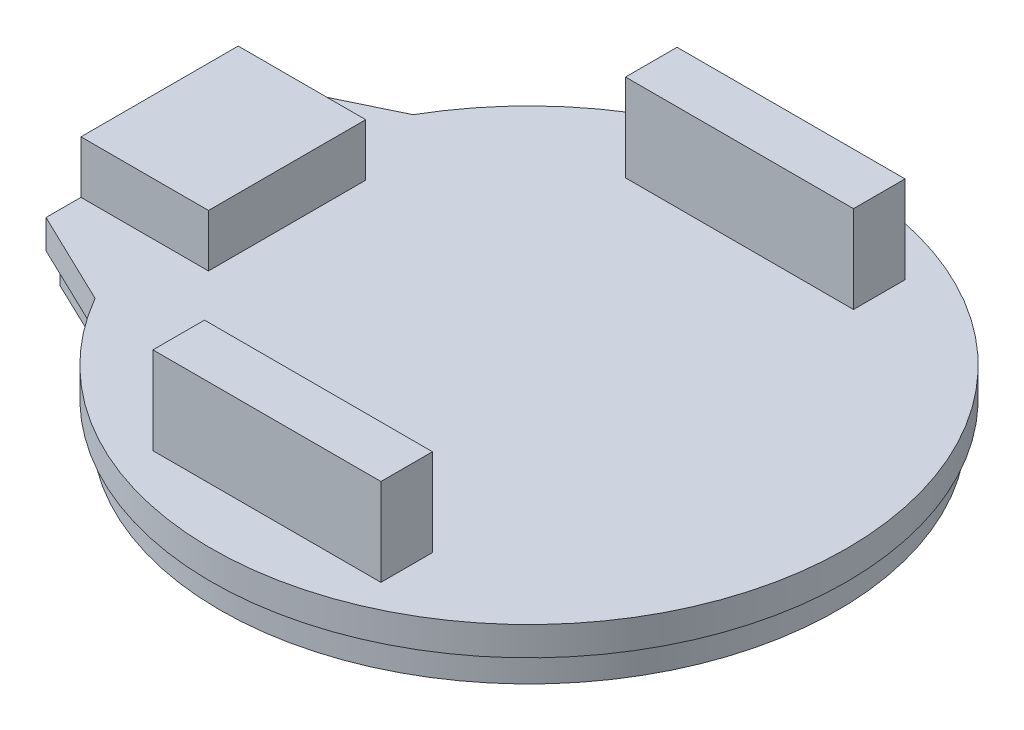
ISO-10303-21;
HEADER;
FILE_DESCRIPTION(('STEP AP214'),'2;1');
FILE_NAME('part.step','',(''),(''),'','','');
FILE_SCHEMA(('AUTOMOTIVE_DESIGN { 1 0 10303 214 1 1 1 1 }'));
ENDSEC;
DATA;
#1=APPLICATION_CONTEXT('core data for automotive mechanical design processes');
#2=APPLICATION_PROTOCOL_DEFINITION('international standard','automotive_design',2000,#1);
#3=PRODUCT_CONTEXT('',#1,'mechanical');
#4=PRODUCT('Part','Part','',(#3));
#5=PRODUCT_RELATED_PRODUCT_CATEGORY('part','',(#4));
#6=PRODUCT_DEFINITION_FORMATION('','',#4);
#7=PRODUCT_DEFINITION_CONTEXT('part definition',#1,'design');
#8=PRODUCT_DEFINITION('design','',#6,#7);
#9=PRODUCT_DEFINITION_SHAPE('','',#8);
#10=(LENGTH_UNIT() NAMED_UNIT(*) SI_UNIT(.MILLI.,.METRE.));
#11=(NAMED_UNIT(*) PLANE_ANGLE_UNIT() SI_UNIT($,.RADIAN.));
#12=(NAMED_UNIT(*) SI_UNIT($,.STERADIAN.) SOLID_ANGLE_UNIT());
#13=UNCERTAINTY_MEASURE_WITH_UNIT(LENGTH_MEASURE(1.E-05),#10,'distance_accuracy_value','');
#14=(GEOMETRIC_REPRESENTATION_CONTEXT(3) GLOBAL_UNCERTAINTY_ASSIGNED_CONTEXT((#13)) GLOBAL_UNIT_ASSIGNED_CONTEXT((#10,
#11,#12)) REPRESENTATION_CONTEXT('',''));
#15=CARTESIAN_POINT('',(0.,0.,0.));
#16=DIRECTION('',(0.,0.,1.));
#17=DIRECTION('',(1.,0.,0.));
#18=AXIS2_PLACEMENT_3D('',#15,#16,#17);
#19=CARTESIAN_POINT('',(10.0040335639318,10.8,419.56));
#20=DIRECTION('',(0.,0.,-1.));
#21=DIRECTION('',(1.,0.,0.));
#22=AXIS2_PLACEMENT_3D('',#19,#20,#21);
#23=PLANE('',#22);
#24=DIRECTION('',(0.,-1.,0.));
#25=VECTOR('',#24,1.);
#26=CARTESIAN_POINT('',(6.35403356393178,10.8,419.56));
#27=LINE('',#26,#25);
#28=CARTESIAN_POINT('',(6.35403356393178,8.8,419.56));
#29=VERTEX_POINT('',#28);
#30=CARTESIAN_POINT('',(6.35403356393178,5.8,419.56));
#31=VERTEX_POINT('',#30);
#32=EDGE_CURVE('E163',#29,#31,#27,.T.);
#33=ORIENTED_EDGE('',*,*,#32,.F.);
#34=DIRECTION('',(1.,0.,0.));
#35=VECTOR('',#34,1.);
#36=CARTESIAN_POINT('',(10.0040335639318,8.8,419.56));
#37=LINE('',#36,#35);
#38=CARTESIAN_POINT('',(13.6540335639318,8.8,419.56));
#39=VERTEX_POINT('',#38);
#40=EDGE_CURVE('E151',#29,#39,#37,.T.);
#41=ORIENTED_EDGE('',*,*,#40,.T.);
#42=DIRECTION('',(0.,-1.,0.));
#43=VECTOR('',#42,1.);
#44=CARTESIAN_POINT('',(13.6540335639318,10.8,419.56));
#45=LINE('',#44,#43);
#46=CARTESIAN_POINT('',(13.6540335639318,5.8,419.56));
#47=VERTEX_POINT('',#46);
#48=EDGE_CURVE('E182',#39,#47,#45,.T.);
#49=ORIENTED_EDGE('',*,*,#48,.T.);
#50=DIRECTION('',(1.,0.,0.));
#51=VECTOR('',#50,1.);
#52=CARTESIAN_POINT('',(10.0040335639318,5.8,419.56));
#53=LINE('',#52,#51);
#54=EDGE_CURVE('E170',#31,#47,#53,.T.);
#55=ORIENTED_EDGE('',*,*,#54,.F.);
#56=EDGE_LOOP('',(#33,#41,#49,#55));
#57=FACE_BOUND('',#56,.T.);
#58=ADVANCED_FACE('F16',(#57),#23,.T.);
#59=CARTESIAN_POINT('',(10.0040335639318,10.8,428.56));
#60=DIRECTION('',(0.,0.,-1.));
#61=DIRECTION('',(1.,0.,0.));
#62=AXIS2_PLACEMENT_3D('',#59,#60,#61);
#63=PLANE('',#62);
#64=DIRECTION('',(1.,0.,0.));
#65=VECTOR('',#64,1.);
#66=CARTESIAN_POINT('',(10.0040335639318,8.8,428.56));
#67=LINE('',#66,#65);
#68=CARTESIAN_POINT('',(6.35403356393178,8.8,428.56));
#69=VERTEX_POINT('',#68);
#70=CARTESIAN_POINT('',(13.6540335639318,8.8,428.56));
#71=VERTEX_POINT('',#70);
#72=EDGE_CURVE('E32',#69,#71,#67,.T.);
#73=ORIENTED_EDGE('',*,*,#72,.F.);
#74=DIRECTION('',(0.,-1.,0.));
#75=VECTOR('',#74,1.);
#76=CARTESIAN_POINT('',(6.35403356393178,10.8,428.56));
#77=LINE('',#76,#75);
#78=CARTESIAN_POINT('',(6.35403356393178,5.8,428.56));
#79=VERTEX_POINT('',#78);
#80=EDGE_CURVE('E166',#69,#79,#77,.T.);
#81=ORIENTED_EDGE('',*,*,#80,.T.);
#82=DIRECTION('',(1.,0.,0.));
#83=VECTOR('',#82,1.);
#84=CARTESIAN_POINT('',(10.0040335639318,5.8,428.56));
#85=LINE('',#84,#83);
#86=CARTESIAN_POINT('',(13.6540335639318,5.8,428.56));
#87=VERTEX_POINT('',#86);
#88=EDGE_CURVE('E251',#79,#87,#85,.T.);
#89=ORIENTED_EDGE('',*,*,#88,.T.);
#90=DIRECTION('',(0.,-1.,0.));
#91=VECTOR('',#90,1.);
#92=CARTESIAN_POINT('',(13.6540335639318,10.8,428.56));
#93=LINE('',#92,#91);
#94=EDGE_CURVE('E176',#71,#87,#93,.T.);
#95=ORIENTED_EDGE('',*,*,#94,.F.);
#96=EDGE_LOOP('',(#73,#81,#89,#95));
#97=FACE_BOUND('',#96,.T.);
#98=ADVANCED_FACE('F322',(#97),#63,.F.);
#99=CARTESIAN_POINT('',(13.6540335639318,10.8,424.06));
#100=DIRECTION('',(1.,0.,0.));
#101=DIRECTION('',(0.,0.,1.));
#102=AXIS2_PLACEMENT_3D('',#99,#100,#101);
#103=PLANE('',#102);
#104=ORIENTED_EDGE('',*,*,#48,.F.);
#105=DIRECTION('',(0.,0.,1.));
#106=VECTOR('',#105,1.);
#107=CARTESIAN_POINT('',(13.6540335639318,8.8,424.06));
#108=LINE('',#107,#106);
#109=EDGE_CURVE('E155',#39,#71,#108,.T.);
#110=ORIENTED_EDGE('',*,*,#109,.T.);
#111=ORIENTED_EDGE('',*,*,#94,.T.);
#112=DIRECTION('',(0.,0.,1.));
#113=VECTOR('',#112,1.);
#114=CARTESIAN_POINT('',(13.6540335639318,5.8,424.06));
#115=LINE('',#114,#113);
#116=EDGE_CURVE('E253',#47,#87,#115,.T.);
#117=ORIENTED_EDGE('',*,*,#116,.F.);
#118=EDGE_LOOP('',(#104,#110,#111,#117));
#119=FACE_BOUND('',#118,.T.);
#120=ADVANCED_FACE('F321',(#119),#103,.T.);
#121=CARTESIAN_POINT('',(26.0170167819659,5.8,424.06));
#122=DIRECTION('',(0.,1.,0.));
#123=DIRECTION('',(0.,0.,1.));
#124=AXIS2_PLACEMENT_3D('',#121,#122,#123);
#125=PLANE('',#124);
#126=DIRECTION('',(0.,0.,1.));
#127=VECTOR('',#126,1.);
#128=CARTESIAN_POINT('',(34.025,5.8,437.585));
#129=LINE('',#128,#127);
#130=CARTESIAN_POINT('',(34.025,5.8,436.11));
#131=VERTEX_POINT('',#130);
#132=CARTESIAN_POINT('',(34.025,5.8,439.06));
#133=VERTEX_POINT('',#132);
#134=EDGE_CURVE('E302',#131,#133,#129,.T.);
#135=ORIENTED_EDGE('',*,*,#134,.T.);
#136=DIRECTION('',(-1.,0.,0.));
#137=VECTOR('',#136,1.);
#138=CARTESIAN_POINT('',(27.5,5.8,439.06));
#139=LINE('',#138,#137);
#140=CARTESIAN_POINT('',(20.975,5.8,439.06));
#141=VERTEX_POINT('',#140);
#142=EDGE_CURVE('E309',#133,#141,#139,.T.);
#143=ORIENTED_EDGE('',*,*,#142,.T.);
#144=DIRECTION('',(0.,0.,1.));
#145=VECTOR('',#144,1.);
#146=CARTESIAN_POINT('',(20.975,5.8,437.585));
#147=LINE('',#146,#145);
#148=CARTESIAN_POINT('',(20.975,5.8,436.11));
#149=VERTEX_POINT('',#148);
#150=EDGE_CURVE('E306',#149,#141,#147,.T.);
#151=ORIENTED_EDGE('',*,*,#150,.F.);
#152=DIRECTION('',(-1.,0.,0.));
#153=VECTOR('',#152,1.);
#154=CARTESIAN_POINT('',(27.5,5.8,436.11));
#155=LINE('',#154,#153);
#156=EDGE_CURVE('E40',#131,#149,#155,.T.);
#157=ORIENTED_EDGE('',*,*,#156,.F.);
#158=EDGE_LOOP('',(#135,#143,#151,#157));
#159=FACE_BOUND('',#158,.T.);
#160=DIRECTION('',(0.,0.,1.));
#161=VECTOR('',#160,1.);
#162=CARTESIAN_POINT('',(34.025,5.8,410.535));
#163=LINE('',#162,#161);
#164=CARTESIAN_POINT('',(34.025,5.8,409.06));
#165=VERTEX_POINT('',#164);
#166=CARTESIAN_POINT('',(34.025,5.8,412.01));
#167=VERTEX_POINT('',#166);
#168=EDGE_CURVE('E280',#165,#167,#163,.T.);
#169=ORIENTED_EDGE('',*,*,#168,.T.);
#170=DIRECTION('',(-1.,0.,0.));
#171=VECTOR('',#170,1.);
#172=CARTESIAN_POINT('',(27.5,5.8,412.01));
#173=LINE('',#172,#171);
#174=CARTESIAN_POINT('',(20.975,5.8,412.01));
#175=VERTEX_POINT('',#174);
#176=EDGE_CURVE('E271',#167,#175,#173,.T.);
#177=ORIENTED_EDGE('',*,*,#176,.T.);
#178=DIRECTION('',(0.,0.,1.));
#179=VECTOR('',#178,1.);
#180=CARTESIAN_POINT('',(20.975,5.8,410.535));
#181=LINE('',#180,#179);
#182=CARTESIAN_POINT('',(20.975,5.8,409.06));
#183=VERTEX_POINT('',#182);
#184=EDGE_CURVE('E274',#183,#175,#181,.T.);
#185=ORIENTED_EDGE('',*,*,#184,.F.);
#186=DIRECTION('',(-1.,0.,0.));
#187=VECTOR('',#186,1.);
#188=CARTESIAN_POINT('',(27.5,5.8,409.06));
#189=LINE('',#188,#187);
#190=EDGE_CURVE('E277',#165,#183,#189,.T.);
#191=ORIENTED_EDGE('',*,*,#190,.F.);
#192=EDGE_LOOP('',(#169,#177,#185,#191));
#193=FACE_BOUND('',#192,.T.);
#194=DIRECTION('',(0.,0.,1.));
#195=VECTOR('',#194,1.);
#196=CARTESIAN_POINT('',(6.35403356393178,5.8,429.56));
#197=LINE('',#196,#195);
#198=CARTESIAN_POINT('',(6.35403356393178,5.8,417.56));
#199=VERTEX_POINT('',#198);
#200=EDGE_CURVE('E227',#199,#31,#197,.T.);
#201=ORIENTED_EDGE('',*,*,#200,.T.);
#202=ORIENTED_EDGE('',*,*,#54,.T.);
#203=ORIENTED_EDGE('',*,*,#116,.T.);
#204=ORIENTED_EDGE('',*,*,#88,.F.);
#205=CARTESIAN_POINT('',(6.35403356393178,5.8,430.56));
#206=VERTEX_POINT('',#205);
#207=EDGE_CURVE('E207',#79,#206,#197,.T.);
#208=ORIENTED_EDGE('',*,*,#207,.T.);
#209=DIRECTION('',(0.901233722306386,0.,0.433333333333332));
#210=VECTOR('',#209,1.);
#211=CARTESIAN_POINT('',(9.05773473085094,5.8,431.86));
#212=LINE('',#211,#210);
#213=CARTESIAN_POINT('',(11.7614358977701,5.8,433.16));
#214=VERTEX_POINT('',#213);
#215=EDGE_CURVE('E229',#206,#214,#212,.T.);
#216=ORIENTED_EDGE('',*,*,#215,.T.);
#217=CARTESIAN_POINT('',(27.5,5.8,424.06));
#218=DIRECTION('',(0.,-1.,0.));
#219=DIRECTION('',(-1.,0.,0.));
#220=AXIS2_PLACEMENT_3D('',#217,#218,#219);
#221=CIRCLE('',#220,18.18);
#222=CARTESIAN_POINT('',(11.7614358977701,5.8,414.96));
#223=VERTEX_POINT('',#222);
#224=EDGE_CURVE('E232',#223,#214,#221,.T.);
#225=ORIENTED_EDGE('',*,*,#224,.F.);
#226=DIRECTION('',(-0.901233722306386,0.,0.433333333333332));
#227=VECTOR('',#226,1.);
#228=CARTESIAN_POINT('',(9.05773473085094,5.8,416.26));
#229=LINE('',#228,#227);
#230=EDGE_CURVE('E217',#223,#199,#229,.T.);
#231=ORIENTED_EDGE('',*,*,#230,.T.);
#232=EDGE_LOOP('',(#201,#202,#203,#204,#208,#216,#225,#231));
#233=FACE_BOUND('',#232,.T.);
#234=ADVANCED_FACE('F246',(#159,#193,#233),#125,.T.);
#235=CARTESIAN_POINT('',(26.0170167819659,4.15,424.06));
#236=DIRECTION('',(0.,1.,0.));
#237=DIRECTION('',(0.,0.,1.));
#238=AXIS2_PLACEMENT_3D('',#235,#236,#237);
#239=PLANE('',#238);
#240=DIRECTION('',(-0.901233722306386,0.,0.433333333333332));
#241=VECTOR('',#240,1.);
#242=CARTESIAN_POINT('',(9.05773473085094,4.15,416.26));
#243=LINE('',#242,#241);
#244=CARTESIAN_POINT('',(11.7614358977701,4.15,414.96));
#245=VERTEX_POINT('',#244);
#246=CARTESIAN_POINT('',(6.35403356393178,4.15,417.56));
#247=VERTEX_POINT('',#246);
#248=EDGE_CURVE('E223',#245,#247,#243,.T.);
#249=ORIENTED_EDGE('',*,*,#248,.F.);
#250=CARTESIAN_POINT('',(27.5,4.15,424.06));
#251=DIRECTION('',(0.,-1.,0.));
#252=DIRECTION('',(-1.,0.,0.));
#253=AXIS2_PLACEMENT_3D('',#250,#251,#252);
#254=CIRCLE('',#253,18.18);
#255=CARTESIAN_POINT('',(11.7614358977701,4.15,433.16));
#256=VERTEX_POINT('',#255);
#257=EDGE_CURVE('E220',#245,#256,#254,.T.);
#258=ORIENTED_EDGE('',*,*,#257,.T.);
#259=DIRECTION('',(0.901233722306386,0.,0.433333333333332));
#260=VECTOR('',#259,1.);
#261=CARTESIAN_POINT('',(9.05773473085094,4.15,431.86));
#262=LINE('',#261,#260);
#263=CARTESIAN_POINT('',(6.35403356393178,4.15,430.56));
#264=VERTEX_POINT('',#263);
#265=EDGE_CURVE('E216',#264,#256,#262,.T.);
#266=ORIENTED_EDGE('',*,*,#265,.F.);
#267=DIRECTION('',(0.,0.,1.));
#268=VECTOR('',#267,1.);
#269=CARTESIAN_POINT('',(6.35403356393178,4.15,429.56));
#270=LINE('',#269,#268);
#271=EDGE_CURVE('E213',#247,#264,#270,.T.);
#272=ORIENTED_EDGE('',*,*,#271,.F.);
#273=EDGE_LOOP('',(#249,#258,#266,#272));
#274=FACE_BOUND('',#273,.T.);
#275=CARTESIAN_POINT('',(27.5,4.15,424.06));
#276=DIRECTION('',(0.,1.,0.));
#277=DIRECTION('',(-1.,0.,0.));
#278=AXIS2_PLACEMENT_3D('',#275,#276,#277);
#279=CIRCLE('',#278,17.68);
#280=CARTESIAN_POINT('',(12.1181560668604,4.15,415.343276004338));
#281=VERTEX_POINT('',#280);
#282=CARTESIAN_POINT('',(12.1181560668604,4.15,432.776723995661));
#283=VERTEX_POINT('',#282);
#284=EDGE_CURVE('E171',#281,#283,#279,.F.);
#285=ORIENTED_EDGE('',*,*,#284,.F.);
#286=DIRECTION('',(0.901233722306386,0.,-0.433333333333332));
#287=VECTOR('',#286,1.);
#288=CARTESIAN_POINT('',(9.27440139751761,4.15,416.710616861153));
#289=LINE('',#288,#287);
#290=CARTESIAN_POINT('',(6.85403356393178,4.15,417.874383856618));
#291=VERTEX_POINT('',#290);
#292=EDGE_CURVE('E203',#281,#291,#289,.F.);
#293=ORIENTED_EDGE('',*,*,#292,.T.);
#294=DIRECTION('',(0.,0.,-1.));
#295=VECTOR('',#294,1.);
#296=CARTESIAN_POINT('',(6.85403356393178,4.15,429.56));
#297=LINE('',#296,#295);
#298=CARTESIAN_POINT('',(6.85403356393178,4.15,430.245616143381));
#299=VERTEX_POINT('',#298);
#300=EDGE_CURVE('E187',#291,#299,#297,.F.);
#301=ORIENTED_EDGE('',*,*,#300,.T.);
#302=DIRECTION('',(-0.901233722306386,0.,-0.433333333333332));
#303=VECTOR('',#302,1.);
#304=CARTESIAN_POINT('',(9.2744013975176,4.15,431.409383138846));
#305=LINE('',#304,#303);
#306=EDGE_CURVE('E193',#299,#283,#305,.F.);
#307=ORIENTED_EDGE('',*,*,#306,.T.);
#308=EDGE_LOOP('',(#285,#293,#301,#307));
#309=FACE_BOUND('',#308,.T.);
#310=ADVANCED_FACE('F356',(#274,#309),#239,.F.);
#311=CARTESIAN_POINT('',(9.05773473085094,4.15,416.26));
#312=DIRECTION('',(-0.433333333333332,0.,-0.901233722306386));
#313=DIRECTION('',(0.901233722306386,0.,-0.433333333333332));
#314=AXIS2_PLACEMENT_3D('',#311,#312,#313);
#315=PLANE('',#314);
#316=ORIENTED_EDGE('',*,*,#230,.F.);
#317=DIRECTION('',(0.,1.,0.));
#318=VECTOR('',#317,1.);
#319=CARTESIAN_POINT('',(11.7614358977701,4.15,414.96));
#320=LINE('',#319,#318);
#321=EDGE_CURVE('E226',#245,#223,#320,.T.);
#322=ORIENTED_EDGE('',*,*,#321,.F.);
#323=ORIENTED_EDGE('',*,*,#248,.T.);
#324=DIRECTION('',(0.,1.,0.));
#325=VECTOR('',#324,1.);
#326=CARTESIAN_POINT('',(6.35403356393178,4.15,417.56));
#327=LINE('',#326,#325);
#328=EDGE_CURVE('E11',#247,#199,#327,.T.);
#329=ORIENTED_EDGE('',*,*,#328,.T.);
#330=EDGE_LOOP('',(#316,#322,#323,#329));
#331=FACE_BOUND('',#330,.T.);
#332=ADVANCED_FACE('F359',(#331),#315,.T.);
#333=CARTESIAN_POINT('',(6.35403356393178,4.15,429.56));
#334=DIRECTION('',(-1.,0.,0.));
#335=DIRECTION('',(0.,0.,-1.));
#336=AXIS2_PLACEMENT_3D('',#333,#334,#335);
#337=PLANE('',#336);
#338=DIRECTION('',(0.,0.,1.));
#339=VECTOR('',#338,1.);
#340=CARTESIAN_POINT('',(6.35403356393178,8.8,424.06));
#341=LINE('',#340,#339);
#342=EDGE_CURVE('E154',#29,#69,#341,.T.);
#343=ORIENTED_EDGE('',*,*,#342,.F.);
#344=ORIENTED_EDGE('',*,*,#32,.T.);
#345=ORIENTED_EDGE('',*,*,#200,.F.);
#346=ORIENTED_EDGE('',*,*,#328,.F.);
#347=ORIENTED_EDGE('',*,*,#271,.T.);
#348=DIRECTION('',(0.,1.,0.));
#349=VECTOR('',#348,1.);
#350=CARTESIAN_POINT('',(6.35403356393178,4.15,430.56));
#351=LINE('',#350,#349);
#352=EDGE_CURVE('E20',#264,#206,#351,.T.);
#353=ORIENTED_EDGE('',*,*,#352,.T.);
#354=ORIENTED_EDGE('',*,*,#207,.F.);
#355=ORIENTED_EDGE('',*,*,#80,.F.);
#356=EDGE_LOOP('',(#343,#344,#345,#346,#347,#353,#354,#355));
#357=FACE_BOUND('',#356,.T.);
#358=ADVANCED_FACE('F18',(#357),#337,.T.);
#359=CARTESIAN_POINT('',(9.05773473085094,4.15,431.86));
#360=DIRECTION('',(-0.433333333333332,0.,0.901233722306386));
#361=DIRECTION('',(-0.901233722306386,0.,-0.433333333333332));
#362=AXIS2_PLACEMENT_3D('',#359,#360,#361);
#363=PLANE('',#362);
#364=ORIENTED_EDGE('',*,*,#215,.F.);
#365=ORIENTED_EDGE('',*,*,#352,.F.);
#366=ORIENTED_EDGE('',*,*,#265,.T.);
#367=DIRECTION('',(0.,1.,0.));
#368=VECTOR('',#367,1.);
#369=CARTESIAN_POINT('',(11.7614358977701,4.15,433.16));
#370=LINE('',#369,#368);
#371=EDGE_CURVE('E237',#256,#214,#370,.T.);
#372=ORIENTED_EDGE('',*,*,#371,.T.);
#373=EDGE_LOOP('',(#364,#365,#366,#372));
#374=FACE_BOUND('',#373,.T.);
#375=ADVANCED_FACE('F243',(#374),#363,.T.);
#376=CARTESIAN_POINT('',(27.5,4.15,424.06));
#377=DIRECTION('',(0.,1.,0.));
#378=DIRECTION('',(-1.,0.,0.));
#379=AXIS2_PLACEMENT_3D('',#376,#377,#378);
#380=CYLINDRICAL_SURFACE('',#379,18.18);
#381=ORIENTED_EDGE('',*,*,#224,.T.);
#382=ORIENTED_EDGE('',*,*,#371,.F.);
#383=ORIENTED_EDGE('',*,*,#257,.F.);
#384=ORIENTED_EDGE('',*,*,#321,.T.);
#385=EDGE_LOOP('',(#381,#382,#383,#384));
#386=FACE_BOUND('',#385,.T.);
#387=ADVANCED_FACE('F338',(#386),#380,.T.);
#388=CARTESIAN_POINT('',(6.85403356393178,2.5,429.56));
#389=DIRECTION('',(-1.,0.,0.));
#390=DIRECTION('',(0.,0.,-1.));
#391=AXIS2_PLACEMENT_3D('',#388,#389,#390);
#392=PLANE('',#391);
#393=ORIENTED_EDGE('',*,*,#300,.F.);
#394=DIRECTION('',(0.,1.,0.));
#395=VECTOR('',#394,1.);
#396=CARTESIAN_POINT('',(6.85403356393178,2.5,417.874383856618));
#397=LINE('',#396,#395);
#398=CARTESIAN_POINT('',(6.85403356393178,2.5,417.874383856618));
#399=VERTEX_POINT('',#398);
#400=EDGE_CURVE('E184',#399,#291,#397,.T.);
#401=ORIENTED_EDGE('',*,*,#400,.F.);
#402=DIRECTION('',(0.,0.,-1.));
#403=VECTOR('',#402,1.);
#404=CARTESIAN_POINT('',(6.85403356393178,2.5,429.56));
#405=LINE('',#404,#403);
#406=CARTESIAN_POINT('',(6.85403356393178,2.5,430.245616143381));
#407=VERTEX_POINT('',#406);
#408=EDGE_CURVE('E201',#399,#407,#405,.F.);
#409=ORIENTED_EDGE('',*,*,#408,.T.);
#410=DIRECTION('',(0.,1.,0.));
#411=VECTOR('',#410,1.);
#412=CARTESIAN_POINT('',(6.85403356393178,2.5,430.245616143381));
#413=LINE('',#412,#411);
#414=EDGE_CURVE('E189',#407,#299,#413,.T.);
#415=ORIENTED_EDGE('',*,*,#414,.T.);
#416=EDGE_LOOP('',(#393,#401,#409,#415));
#417=FACE_BOUND('',#416,.T.);
#418=ADVANCED_FACE('F334',(#417),#392,.T.);
#419=CARTESIAN_POINT('',(9.27440139751761,2.5,416.710616861153));
#420=DIRECTION('',(-0.433333333333332,0.,-0.901233722306386));
#421=DIRECTION('',(0.901233722306386,0.,-0.433333333333332));
#422=AXIS2_PLACEMENT_3D('',#419,#420,#421);
#423=PLANE('',#422);
#424=ORIENTED_EDGE('',*,*,#292,.F.);
#425=DIRECTION('',(0.,1.,0.));
#426=VECTOR('',#425,1.);
#427=CARTESIAN_POINT('',(12.1181560668604,2.5,415.343276004338));
#428=LINE('',#427,#426);
#429=CARTESIAN_POINT('',(12.1181560668604,2.5,415.343276004338));
#430=VERTEX_POINT('',#429);
#431=EDGE_CURVE('E194',#430,#281,#428,.T.);
#432=ORIENTED_EDGE('',*,*,#431,.F.);
#433=DIRECTION('',(0.901233722306386,0.,-0.433333333333332));
#434=VECTOR('',#433,1.);
#435=CARTESIAN_POINT('',(9.27440139751761,2.5,416.710616861153));
#436=LINE('',#435,#434);
#437=EDGE_CURVE('E188',#430,#399,#436,.F.);
#438=ORIENTED_EDGE('',*,*,#437,.T.);
#439=ORIENTED_EDGE('',*,*,#400,.T.);
#440=EDGE_LOOP('',(#424,#432,#438,#439));
#441=FACE_BOUND('',#440,.T.);
#442=ADVANCED_FACE('F337',(#441),#423,.T.);
#443=CARTESIAN_POINT('',(9.2744013975176,2.5,431.409383138846));
#444=DIRECTION('',(-0.433333333333332,0.,0.901233722306386));
#445=DIRECTION('',(-0.901233722306386,0.,-0.433333333333332));
#446=AXIS2_PLACEMENT_3D('',#443,#444,#445);
#447=PLANE('',#446);
#448=ORIENTED_EDGE('',*,*,#306,.F.);
#449=ORIENTED_EDGE('',*,*,#414,.F.);
#450=DIRECTION('',(-0.901233722306386,0.,-0.433333333333332));
#451=VECTOR('',#450,1.);
#452=CARTESIAN_POINT('',(9.2744013975176,2.5,431.409383138846));
#453=LINE('',#452,#451);
#454=CARTESIAN_POINT('',(12.1181560668604,2.5,432.776723995661));
#455=VERTEX_POINT('',#454);
#456=EDGE_CURVE('E192',#407,#455,#453,.F.);
#457=ORIENTED_EDGE('',*,*,#456,.T.);
#458=DIRECTION('',(0.,1.,0.));
#459=VECTOR('',#458,1.);
#460=CARTESIAN_POINT('',(12.1181560668604,2.5,432.776723995661));
#461=LINE('',#460,#459);
#462=EDGE_CURVE('E174',#455,#283,#461,.T.);
#463=ORIENTED_EDGE('',*,*,#462,.T.);
#464=EDGE_LOOP('',(#448,#449,#457,#463));
#465=FACE_BOUND('',#464,.T.);
#466=ADVANCED_FACE('F342',(#465),#447,.T.);
#467=CARTESIAN_POINT('',(27.5,2.5,424.06));
#468=DIRECTION('',(0.,1.,0.));
#469=DIRECTION('',(-1.,0.,0.));
#470=AXIS2_PLACEMENT_3D('',#467,#468,#469);
#471=CYLINDRICAL_SURFACE('',#470,17.68);
#472=ORIENTED_EDGE('',*,*,#284,.T.);
#473=ORIENTED_EDGE('',*,*,#462,.F.);
#474=CARTESIAN_POINT('',(27.5,2.5,424.06));
#475=DIRECTION('',(0.,1.,0.));
#476=DIRECTION('',(-1.,0.,0.));
#477=AXIS2_PLACEMENT_3D('',#474,#475,#476);
#478=CIRCLE('',#477,17.68);
#479=EDGE_CURVE('E197',#430,#455,#478,.F.);
#480=ORIENTED_EDGE('',*,*,#479,.F.);
#481=ORIENTED_EDGE('',*,*,#431,.T.);
#482=EDGE_LOOP('',(#472,#473,#480,#481));
#483=FACE_BOUND('',#482,.T.);
#484=ADVANCED_FACE('F346',(#483),#471,.T.);
#485=CARTESIAN_POINT('',(26.0170167819659,2.5,424.06));
#486=DIRECTION('',(0.,1.,0.));
#487=DIRECTION('',(0.,0.,1.));
#488=AXIS2_PLACEMENT_3D('',#485,#486,#487);
#489=PLANE('',#488);
#490=ORIENTED_EDGE('',*,*,#408,.F.);
#491=ORIENTED_EDGE('',*,*,#437,.F.);
#492=ORIENTED_EDGE('',*,*,#479,.T.);
#493=ORIENTED_EDGE('',*,*,#456,.F.);
#494=EDGE_LOOP('',(#490,#491,#492,#493));
#495=FACE_BOUND('',#494,.T.);
#496=ADVANCED_FACE('F350',(#495),#489,.F.);
#497=CARTESIAN_POINT('',(34.025,10.8,410.535));
#498=DIRECTION('',(1.,0.,0.));
#499=DIRECTION('',(0.,0.,1.));
#500=AXIS2_PLACEMENT_3D('',#497,#498,#499);
#501=PLANE('',#500);
#502=ORIENTED_EDGE('',*,*,#168,.F.);
#503=DIRECTION('',(0.,-1.,0.));
#504=VECTOR('',#503,1.);
#505=CARTESIAN_POINT('',(34.025,10.8,409.06));
#506=LINE('',#505,#504);
#507=CARTESIAN_POINT('',(34.025,10.8,409.06));
#508=VERTEX_POINT('',#507);
#509=EDGE_CURVE('E256',#508,#165,#506,.T.);
#510=ORIENTED_EDGE('',*,*,#509,.F.);
#511=DIRECTION('',(0.,0.,1.));
#512=VECTOR('',#511,1.);
#513=CARTESIAN_POINT('',(34.025,10.8,410.535));
#514=LINE('',#513,#512);
#515=CARTESIAN_POINT('',(34.025,10.8,412.01));
#516=VERTEX_POINT('',#515);
#517=EDGE_CURVE('E273',#508,#516,#514,.T.);
#518=ORIENTED_EDGE('',*,*,#517,.T.);
#519=DIRECTION('',(0.,-1.,0.));
#520=VECTOR('',#519,1.);
#521=CARTESIAN_POINT('',(34.025,10.8,412.01));
#522=LINE('',#521,#520);
#523=EDGE_CURVE('E267',#516,#167,#522,.T.);
#524=ORIENTED_EDGE('',*,*,#523,.T.);
#525=EDGE_LOOP('',(#502,#510,#518,#524));
#526=FACE_BOUND('',#525,.T.);
#527=ADVANCED_FACE('F354',(#526),#501,.T.);
#528=CARTESIAN_POINT('',(27.5,10.8,409.06));
#529=DIRECTION('',(0.,0.,1.));
#530=DIRECTION('',(-1.,0.,0.));
#531=AXIS2_PLACEMENT_3D('',#528,#529,#530);
#532=PLANE('',#531);
#533=ORIENTED_EDGE('',*,*,#190,.T.);
#534=DIRECTION('',(0.,-1.,0.));
#535=VECTOR('',#534,1.);
#536=CARTESIAN_POINT('',(20.975,10.8,409.06));
#537=LINE('',#536,#535);
#538=CARTESIAN_POINT('',(20.975,10.8,409.06));
#539=VERTEX_POINT('',#538);
#540=EDGE_CURVE('E261',#539,#183,#537,.T.);
#541=ORIENTED_EDGE('',*,*,#540,.F.);
#542=DIRECTION('',(-1.,0.,0.));
#543=VECTOR('',#542,1.);
#544=CARTESIAN_POINT('',(27.5,10.8,409.06));
#545=LINE('',#544,#543);
#546=EDGE_CURVE('E287',#508,#539,#545,.T.);
#547=ORIENTED_EDGE('',*,*,#546,.F.);
#548=ORIENTED_EDGE('',*,*,#509,.T.);
#549=EDGE_LOOP('',(#533,#541,#547,#548));
#550=FACE_BOUND('',#549,.T.);
#551=ADVANCED_FACE('F465',(#550),#532,.F.);
#552=CARTESIAN_POINT('',(20.975,10.8,410.535));
#553=DIRECTION('',(1.,0.,0.));
#554=DIRECTION('',(0.,0.,1.));
#555=AXIS2_PLACEMENT_3D('',#552,#553,#554);
#556=PLANE('',#555);
#557=ORIENTED_EDGE('',*,*,#184,.T.);
#558=DIRECTION('',(0.,-1.,0.));
#559=VECTOR('',#558,1.);
#560=CARTESIAN_POINT('',(20.975,10.8,412.01));
#561=LINE('',#560,#559);
#562=CARTESIAN_POINT('',(20.975,10.8,412.01));
#563=VERTEX_POINT('',#562);
#564=EDGE_CURVE('E264',#563,#175,#561,.T.);
#565=ORIENTED_EDGE('',*,*,#564,.F.);
#566=DIRECTION('',(0.,0.,1.));
#567=VECTOR('',#566,1.);
#568=CARTESIAN_POINT('',(20.975,10.8,410.535));
#569=LINE('',#568,#567);
#570=EDGE_CURVE('E285',#539,#563,#569,.T.);
#571=ORIENTED_EDGE('',*,*,#570,.F.);
#572=ORIENTED_EDGE('',*,*,#540,.T.);
#573=EDGE_LOOP('',(#557,#565,#571,#572));
#574=FACE_BOUND('',#573,.T.);
#575=ADVANCED_FACE('F473',(#574),#556,.F.);
#576=CARTESIAN_POINT('',(27.5,10.8,412.01));
#577=DIRECTION('',(0.,0.,1.));
#578=DIRECTION('',(-1.,0.,0.));
#579=AXIS2_PLACEMENT_3D('',#576,#577,#578);
#580=PLANE('',#579);
#581=ORIENTED_EDGE('',*,*,#176,.F.);
#582=ORIENTED_EDGE('',*,*,#523,.F.);
#583=DIRECTION('',(-1.,0.,0.));
#584=VECTOR('',#583,1.);
#585=CARTESIAN_POINT('',(27.5,10.8,412.01));
#586=LINE('',#585,#584);
#587=EDGE_CURVE('E270',#516,#563,#586,.T.);
#588=ORIENTED_EDGE('',*,*,#587,.T.);
#589=ORIENTED_EDGE('',*,*,#564,.T.);
#590=EDGE_LOOP('',(#581,#582,#588,#589));
#591=FACE_BOUND('',#590,.T.);
#592=ADVANCED_FACE('F482',(#591),#580,.T.);
#593=CARTESIAN_POINT('',(26.0170167819659,10.8,424.06));
#594=DIRECTION('',(0.,1.,0.));
#595=DIRECTION('',(0.,0.,1.));
#596=AXIS2_PLACEMENT_3D('',#593,#594,#595);
#597=PLANE('',#596);
#598=ORIENTED_EDGE('',*,*,#517,.F.);
#599=ORIENTED_EDGE('',*,*,#546,.T.);
#600=ORIENTED_EDGE('',*,*,#570,.T.);
#601=ORIENTED_EDGE('',*,*,#587,.F.);
#602=EDGE_LOOP('',(#598,#599,#600,#601));
#603=FACE_BOUND('',#602,.T.);
#604=ADVANCED_FACE('F491',(#603),#597,.T.);
#605=CARTESIAN_POINT('',(34.025,10.8,437.585));
#606=DIRECTION('',(1.,0.,0.));
#607=DIRECTION('',(0.,0.,1.));
#608=AXIS2_PLACEMENT_3D('',#605,#606,#607);
#609=PLANE('',#608);
#610=ORIENTED_EDGE('',*,*,#134,.F.);
#611=DIRECTION('',(0.,-1.,0.));
#612=VECTOR('',#611,1.);
#613=CARTESIAN_POINT('',(34.025,10.8,436.11));
#614=LINE('',#613,#612);
#615=CARTESIAN_POINT('',(34.025,10.8,436.11));
#616=VERTEX_POINT('',#615);
#617=EDGE_CURVE('E282',#616,#131,#614,.T.);
#618=ORIENTED_EDGE('',*,*,#617,.F.);
#619=DIRECTION('',(0.,0.,1.));
#620=VECTOR('',#619,1.);
#621=CARTESIAN_POINT('',(34.025,10.8,437.585));
#622=LINE('',#621,#620);
#623=CARTESIAN_POINT('',(34.025,10.8,439.06));
#624=VERTEX_POINT('',#623);
#625=EDGE_CURVE('E295',#616,#624,#622,.T.);
#626=ORIENTED_EDGE('',*,*,#625,.T.);
#627=DIRECTION('',(0.,-1.,0.));
#628=VECTOR('',#627,1.);
#629=CARTESIAN_POINT('',(34.025,10.8,439.06));
#630=LINE('',#629,#628);
#631=EDGE_CURVE('E291',#624,#133,#630,.T.);
#632=ORIENTED_EDGE('',*,*,#631,.T.);
#633=EDGE_LOOP('',(#610,#618,#626,#632));
#634=FACE_BOUND('',#633,.T.);
#635=ADVANCED_FACE('F500',(#634),#609,.T.);
#636=CARTESIAN_POINT('',(27.5,10.8,436.11));
#637=DIRECTION('',(0.,0.,1.));
#638=DIRECTION('',(-1.,0.,0.));
#639=AXIS2_PLACEMENT_3D('',#636,#637,#638);
#640=PLANE('',#639);
#641=ORIENTED_EDGE('',*,*,#156,.T.);
#642=DIRECTION('',(0.,-1.,0.));
#643=VECTOR('',#642,1.);
#644=CARTESIAN_POINT('',(20.975,10.8,436.11));
#645=LINE('',#644,#643);
#646=CARTESIAN_POINT('',(20.975,10.8,436.11));
#647=VERTEX_POINT('',#646);
#648=EDGE_CURVE('E298',#647,#149,#645,.T.);
#649=ORIENTED_EDGE('',*,*,#648,.F.);
#650=DIRECTION('',(-1.,0.,0.));
#651=VECTOR('',#650,1.);
#652=CARTESIAN_POINT('',(27.5,10.8,436.11));
#653=LINE('',#652,#651);
#654=EDGE_CURVE('E313',#616,#647,#653,.T.);
#655=ORIENTED_EDGE('',*,*,#654,.F.);
#656=ORIENTED_EDGE('',*,*,#617,.T.);
#657=EDGE_LOOP('',(#641,#649,#655,#656));
#658=FACE_BOUND('',#657,.T.);
#659=ADVANCED_FACE('F509',(#658),#640,.F.);
#660=CARTESIAN_POINT('',(20.975,10.8,437.585));
#661=DIRECTION('',(1.,0.,0.));
#662=DIRECTION('',(0.,0.,1.));
#663=AXIS2_PLACEMENT_3D('',#660,#661,#662);
#664=PLANE('',#663);
#665=ORIENTED_EDGE('',*,*,#150,.T.);
#666=DIRECTION('',(0.,-1.,0.));
#667=VECTOR('',#666,1.);
#668=CARTESIAN_POINT('',(20.975,10.8,439.06));
#669=LINE('',#668,#667);
#670=CARTESIAN_POINT('',(20.975,10.8,439.06));
#671=VERTEX_POINT('',#670);
#672=EDGE_CURVE('E294',#671,#141,#669,.T.);
#673=ORIENTED_EDGE('',*,*,#672,.F.);
#674=DIRECTION('',(0.,0.,1.));
#675=VECTOR('',#674,1.);
#676=CARTESIAN_POINT('',(20.975,10.8,437.585));
#677=LINE('',#676,#675);
#678=EDGE_CURVE('E315',#647,#671,#677,.T.);
#679=ORIENTED_EDGE('',*,*,#678,.F.);
#680=ORIENTED_EDGE('',*,*,#648,.T.);
#681=EDGE_LOOP('',(#665,#673,#679,#680));
#682=FACE_BOUND('',#681,.T.);
#683=ADVANCED_FACE('F518',(#682),#664,.F.);
#684=CARTESIAN_POINT('',(27.5,10.8,439.06));
#685=DIRECTION('',(0.,0.,1.));
#686=DIRECTION('',(-1.,0.,0.));
#687=AXIS2_PLACEMENT_3D('',#684,#685,#686);
#688=PLANE('',#687);
#689=ORIENTED_EDGE('',*,*,#142,.F.);
#690=ORIENTED_EDGE('',*,*,#631,.F.);
#691=DIRECTION('',(-1.,0.,0.));
#692=VECTOR('',#691,1.);
#693=CARTESIAN_POINT('',(27.5,10.8,439.06));
#694=LINE('',#693,#692);
#695=EDGE_CURVE('E304',#624,#671,#694,.T.);
#696=ORIENTED_EDGE('',*,*,#695,.T.);
#697=ORIENTED_EDGE('',*,*,#672,.T.);
#698=EDGE_LOOP('',(#689,#690,#696,#697));
#699=FACE_BOUND('',#698,.T.);
#700=ADVANCED_FACE('F527',(#699),#688,.T.);
#701=CARTESIAN_POINT('',(26.0170167819659,10.8,424.06));
#702=DIRECTION('',(0.,1.,0.));
#703=DIRECTION('',(0.,0.,1.));
#704=AXIS2_PLACEMENT_3D('',#701,#702,#703);
#705=PLANE('',#704);
#706=ORIENTED_EDGE('',*,*,#625,.F.);
#707=ORIENTED_EDGE('',*,*,#654,.T.);
#708=ORIENTED_EDGE('',*,*,#678,.T.);
#709=ORIENTED_EDGE('',*,*,#695,.F.);
#710=EDGE_LOOP('',(#706,#707,#708,#709));
#711=FACE_BOUND('',#710,.T.);
#712=ADVANCED_FACE('F536',(#711),#705,.T.);
#713=CARTESIAN_POINT('',(26.0170167819659,8.8,424.06));
#714=DIRECTION('',(0.,1.,0.));
#715=DIRECTION('',(0.,0.,1.));
#716=AXIS2_PLACEMENT_3D('',#713,#714,#715);
#717=PLANE('',#716);
#718=ORIENTED_EDGE('',*,*,#40,.F.);
#719=ORIENTED_EDGE('',*,*,#342,.T.);
#720=ORIENTED_EDGE('',*,*,#72,.T.);
#721=ORIENTED_EDGE('',*,*,#109,.F.);
#722=EDGE_LOOP('',(#718,#719,#720,#721));
#723=FACE_BOUND('',#722,.T.);
#724=ADVANCED_FACE('F153',(#723),#717,.T.);
#725=CLOSED_SHELL('',(#58,#98,#120,#234,#310,#332,#358,#375,#387,#418,#442,#466,#484,#496,#527,
#551,#575,#592,#604,#635,#659,#683,#700,#712,#724));
#726=MANIFOLD_SOLID_BREP('B1',#725);
#727=ADVANCED_BREP_SHAPE_REPRESENTATION('',(#18,#726),#14);
#728=SHAPE_DEFINITION_REPRESENTATION(#9,#727);
ENDSEC;
END-ISO-10303-21;
